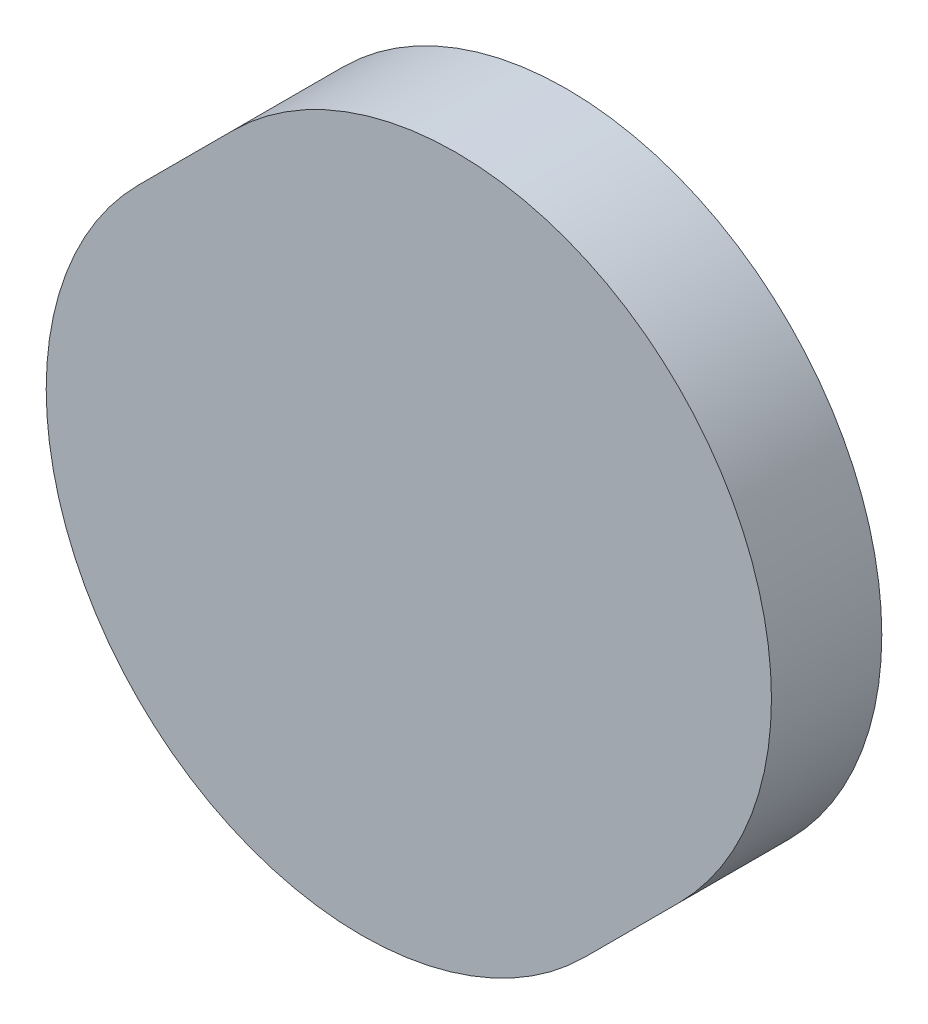
ISO-10303-21;
HEADER;
FILE_DESCRIPTION(('STEP AP214'),'2;1');
FILE_NAME('part.step','',(''),(''),'','','');
FILE_SCHEMA(('AUTOMOTIVE_DESIGN { 1 0 10303 214 1 1 1 1 }'));
ENDSEC;
DATA;
#1=APPLICATION_CONTEXT('core data for automotive mechanical design processes');
#2=APPLICATION_PROTOCOL_DEFINITION('international standard','automotive_design',2000,#1);
#3=PRODUCT_CONTEXT('',#1,'mechanical');
#4=PRODUCT('Part','Part','',(#3));
#5=PRODUCT_RELATED_PRODUCT_CATEGORY('part','',(#4));
#6=PRODUCT_DEFINITION_FORMATION('','',#4);
#7=PRODUCT_DEFINITION_CONTEXT('part definition',#1,'design');
#8=PRODUCT_DEFINITION('design','',#6,#7);
#9=PRODUCT_DEFINITION_SHAPE('','',#8);
#10=(LENGTH_UNIT() NAMED_UNIT(*) SI_UNIT(.MILLI.,.METRE.));
#11=(NAMED_UNIT(*) PLANE_ANGLE_UNIT() SI_UNIT($,.RADIAN.));
#12=(NAMED_UNIT(*) SI_UNIT($,.STERADIAN.) SOLID_ANGLE_UNIT());
#13=UNCERTAINTY_MEASURE_WITH_UNIT(LENGTH_MEASURE(1.E-05),#10,'distance_accuracy_value','');
#14=(GEOMETRIC_REPRESENTATION_CONTEXT(3) GLOBAL_UNCERTAINTY_ASSIGNED_CONTEXT((#13)) GLOBAL_UNIT_ASSIGNED_CONTEXT((#10,
#11,#12)) REPRESENTATION_CONTEXT('',''));
#15=CARTESIAN_POINT('',(0.,0.,0.));
#16=DIRECTION('',(0.,0.,1.));
#17=DIRECTION('',(1.,0.,0.));
#18=AXIS2_PLACEMENT_3D('',#15,#16,#17);
#19=CARTESIAN_POINT('',(108.26871,-121.38471,1.635));
#20=DIRECTION('',(0.,0.,1.));
#21=DIRECTION('',(1.,0.,0.));
#22=AXIS2_PLACEMENT_3D('',#19,#20,#21);
#23=PLANE('',#22);
#24=DIRECTION('',(0.707106781186548,0.707106781186548,0.));
#25=VECTOR('',#24,1.);
#26=CARTESIAN_POINT('',(108.26871,-121.38471,1.635));
#27=LINE('',#26,#25);
#28=CARTESIAN_POINT('',(108.26871,-121.38471,1.635));
#29=VERTEX_POINT('',#28);
#30=CARTESIAN_POINT('',(108.29871,-121.35471,1.635));
#31=VERTEX_POINT('',#30);
#32=EDGE_CURVE('E89',#29,#31,#27,.T.);
#33=ORIENTED_EDGE('',*,*,#32,.T.);
#34=CARTESIAN_POINT('',(108.2279995,-121.2839995,1.635));
#35=DIRECTION('',(0.,0.,1.));
#36=DIRECTION('',(0.707106781186048,-0.707106781187048,0.));
#37=AXIS2_PLACEMENT_3D('',#34,#35,#36);
#38=CIRCLE('',#37,0.09999974810218);
#39=CARTESIAN_POINT('',(108.157289,-121.213289,1.635));
#40=VERTEX_POINT('',#39);
#41=EDGE_CURVE('E115',#31,#40,#38,.T.);
#42=ORIENTED_EDGE('',*,*,#41,.T.);
#43=DIRECTION('',(-0.707106781186548,-0.707106781186548,0.));
#44=VECTOR('',#43,1.);
#45=CARTESIAN_POINT('',(108.157289,-121.213289,1.635));
#46=LINE('',#45,#44);
#47=CARTESIAN_POINT('',(108.127289,-121.243289,1.635));
#48=VERTEX_POINT('',#47);
#49=EDGE_CURVE('E51',#40,#48,#46,.T.);
#50=ORIENTED_EDGE('',*,*,#49,.T.);
#51=CARTESIAN_POINT('',(108.1979995,-121.3139995,1.635));
#52=DIRECTION('',(0.,0.,1.));
#53=DIRECTION('',(-0.707106781187048,0.707106781186048,0.));
#54=AXIS2_PLACEMENT_3D('',#51,#52,#53);
#55=CIRCLE('',#54,0.09999974810218);
#56=EDGE_CURVE('E11',#48,#29,#55,.T.);
#57=ORIENTED_EDGE('',*,*,#56,.T.);
#58=EDGE_LOOP('',(#33,#42,#50,#57));
#59=FACE_BOUND('',#58,.T.);
#60=ADVANCED_FACE('F17',(#59),#23,.T.);
#61=CARTESIAN_POINT('',(108.26871,-121.38471,1.6));
#62=DIRECTION('',(0.,0.,1.));
#63=DIRECTION('',(1.,0.,0.));
#64=AXIS2_PLACEMENT_3D('',#61,#62,#63);
#65=PLANE('',#64);
#66=CARTESIAN_POINT('',(108.1979995,-121.3139995,1.6));
#67=DIRECTION('',(0.,0.,1.));
#68=DIRECTION('',(-0.707106781187048,0.707106781186048,0.));
#69=AXIS2_PLACEMENT_3D('',#66,#67,#68);
#70=CIRCLE('',#69,0.09999974810218);
#71=CARTESIAN_POINT('',(108.127289,-121.243289,1.6));
#72=VERTEX_POINT('',#71);
#73=CARTESIAN_POINT('',(108.26871,-121.38471,1.6));
#74=VERTEX_POINT('',#73);
#75=EDGE_CURVE('E27',#72,#74,#70,.T.);
#76=ORIENTED_EDGE('',*,*,#75,.F.);
#77=DIRECTION('',(-0.707106781186548,-0.707106781186548,0.));
#78=VECTOR('',#77,1.);
#79=CARTESIAN_POINT('',(108.157289,-121.213289,1.6));
#80=LINE('',#79,#78);
#81=CARTESIAN_POINT('',(108.157289,-121.213289,1.6));
#82=VERTEX_POINT('',#81);
#83=EDGE_CURVE('E60',#82,#72,#80,.T.);
#84=ORIENTED_EDGE('',*,*,#83,.F.);
#85=CARTESIAN_POINT('',(108.2279995,-121.2839995,1.6));
#86=DIRECTION('',(0.,0.,1.));
#87=DIRECTION('',(0.707106781186048,-0.707106781187048,0.));
#88=AXIS2_PLACEMENT_3D('',#85,#86,#87);
#89=CIRCLE('',#88,0.09999974810218);
#90=CARTESIAN_POINT('',(108.29871,-121.35471,1.6));
#91=VERTEX_POINT('',#90);
#92=EDGE_CURVE('E91',#91,#82,#89,.T.);
#93=ORIENTED_EDGE('',*,*,#92,.F.);
#94=DIRECTION('',(0.707106781186548,0.707106781186548,0.));
#95=VECTOR('',#94,1.);
#96=CARTESIAN_POINT('',(108.26871,-121.38471,1.6));
#97=LINE('',#96,#95);
#98=EDGE_CURVE('E88',#74,#91,#97,.T.);
#99=ORIENTED_EDGE('',*,*,#98,.F.);
#100=EDGE_LOOP('',(#76,#84,#93,#99));
#101=FACE_BOUND('',#100,.T.);
#102=ADVANCED_FACE('F93',(#101),#65,.F.);
#103=CARTESIAN_POINT('',(108.1979995,-121.3139995,1.6));
#104=DIRECTION('',(0.,0.,-1.));
#105=DIRECTION('',(-0.707106781187048,0.707106781186048,0.));
#106=AXIS2_PLACEMENT_3D('',#103,#104,#105);
#107=CYLINDRICAL_SURFACE('',#106,0.09999974810218);
#108=ORIENTED_EDGE('',*,*,#75,.T.);
#109=DIRECTION('',(0.,0.,1.));
#110=VECTOR('',#109,1.);
#111=CARTESIAN_POINT('',(108.26871,-121.38471,1.6));
#112=LINE('',#111,#110);
#113=EDGE_CURVE('E79',#74,#29,#112,.T.);
#114=ORIENTED_EDGE('',*,*,#113,.T.);
#115=ORIENTED_EDGE('',*,*,#56,.F.);
#116=DIRECTION('',(0.,0.,1.));
#117=VECTOR('',#116,1.);
#118=CARTESIAN_POINT('',(108.127289,-121.243289,1.6));
#119=LINE('',#118,#117);
#120=EDGE_CURVE('E20',#72,#48,#119,.T.);
#121=ORIENTED_EDGE('',*,*,#120,.F.);
#122=EDGE_LOOP('',(#108,#114,#115,#121));
#123=FACE_BOUND('',#122,.T.);
#124=ADVANCED_FACE('F78',(#123),#107,.T.);
#125=CARTESIAN_POINT('',(108.157289,-121.213289,1.6));
#126=DIRECTION('',(0.707106781186548,-0.707106781186548,0.));
#127=DIRECTION('',(0.,0.,-1.));
#128=AXIS2_PLACEMENT_3D('',#125,#126,#127);
#129=PLANE('',#128);
#130=ORIENTED_EDGE('',*,*,#83,.T.);
#131=ORIENTED_EDGE('',*,*,#120,.T.);
#132=ORIENTED_EDGE('',*,*,#49,.F.);
#133=DIRECTION('',(0.,0.,1.));
#134=VECTOR('',#133,1.);
#135=CARTESIAN_POINT('',(108.157289,-121.213289,1.6));
#136=LINE('',#135,#134);
#137=EDGE_CURVE('E110',#82,#40,#136,.T.);
#138=ORIENTED_EDGE('',*,*,#137,.F.);
#139=EDGE_LOOP('',(#130,#131,#132,#138));
#140=FACE_BOUND('',#139,.T.);
#141=ADVANCED_FACE('F123',(#140),#129,.F.);
#142=CARTESIAN_POINT('',(108.2279995,-121.2839995,1.6));
#143=DIRECTION('',(0.,0.,-1.));
#144=DIRECTION('',(0.707106781186048,-0.707106781187048,0.));
#145=AXIS2_PLACEMENT_3D('',#142,#143,#144);
#146=CYLINDRICAL_SURFACE('',#145,0.09999974810218);
#147=ORIENTED_EDGE('',*,*,#92,.T.);
#148=ORIENTED_EDGE('',*,*,#137,.T.);
#149=ORIENTED_EDGE('',*,*,#41,.F.);
#150=DIRECTION('',(0.,0.,1.));
#151=VECTOR('',#150,1.);
#152=CARTESIAN_POINT('',(108.29871,-121.35471,1.6));
#153=LINE('',#152,#151);
#154=EDGE_CURVE('E97',#91,#31,#153,.T.);
#155=ORIENTED_EDGE('',*,*,#154,.F.);
#156=EDGE_LOOP('',(#147,#148,#149,#155));
#157=FACE_BOUND('',#156,.T.);
#158=ADVANCED_FACE('F125',(#157),#146,.T.);
#159=CARTESIAN_POINT('',(108.26871,-121.38471,1.6));
#160=DIRECTION('',(-0.707106781186548,0.707106781186548,0.));
#161=DIRECTION('',(0.,0.,1.));
#162=AXIS2_PLACEMENT_3D('',#159,#160,#161);
#163=PLANE('',#162);
#164=ORIENTED_EDGE('',*,*,#98,.T.);
#165=ORIENTED_EDGE('',*,*,#154,.T.);
#166=ORIENTED_EDGE('',*,*,#32,.F.);
#167=ORIENTED_EDGE('',*,*,#113,.F.);
#168=EDGE_LOOP('',(#164,#165,#166,#167));
#169=FACE_BOUND('',#168,.T.);
#170=ADVANCED_FACE('F86',(#169),#163,.F.);
#171=CLOSED_SHELL('',(#60,#102,#124,#141,#158,#170));
#172=MANIFOLD_SOLID_BREP('B1',#171);
#173=ADVANCED_BREP_SHAPE_REPRESENTATION('',(#18,#172),#14);
#174=SHAPE_DEFINITION_REPRESENTATION(#9,#173);
ENDSEC;
END-ISO-10303-21;
